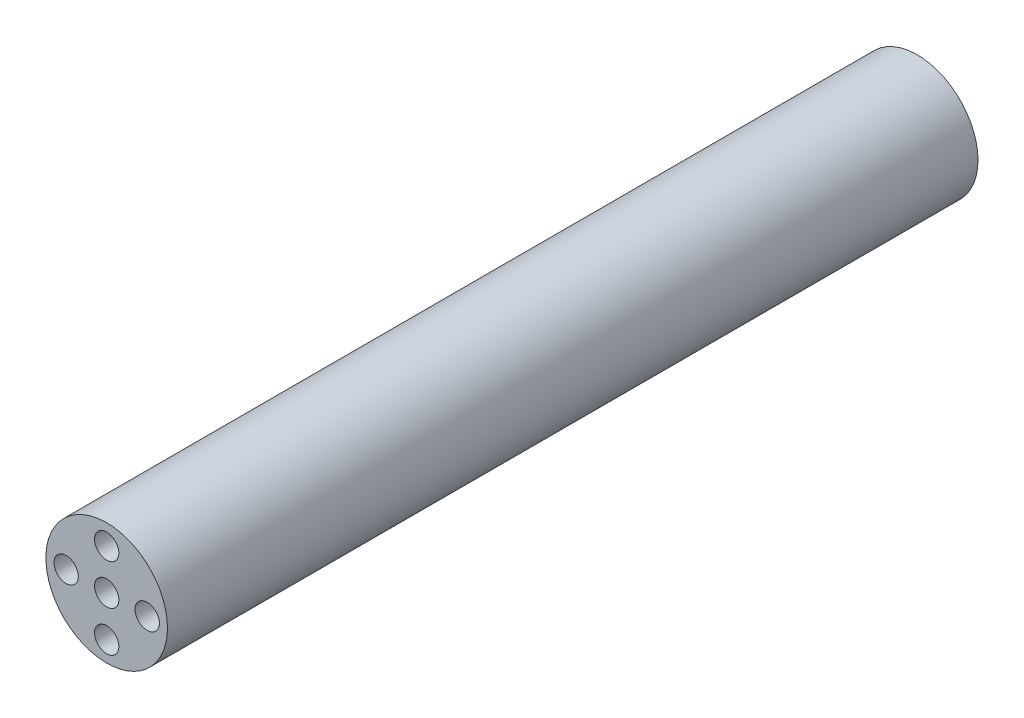
ISO-10303-21;
HEADER;
FILE_DESCRIPTION(('STEP AP214'),'2;1');
FILE_NAME('part.step','',(''),(''),'','','');
FILE_SCHEMA(('AUTOMOTIVE_DESIGN { 1 0 10303 214 1 1 1 1 }'));
ENDSEC;
DATA;
#1=APPLICATION_CONTEXT('core data for automotive mechanical design processes');
#2=APPLICATION_PROTOCOL_DEFINITION('international standard','automotive_design',2000,#1);
#3=PRODUCT_CONTEXT('',#1,'mechanical');
#4=PRODUCT('Part','Part','',(#3));
#5=PRODUCT_RELATED_PRODUCT_CATEGORY('part','',(#4));
#6=PRODUCT_DEFINITION_FORMATION('','',#4);
#7=PRODUCT_DEFINITION_CONTEXT('part definition',#1,'design');
#8=PRODUCT_DEFINITION('design','',#6,#7);
#9=PRODUCT_DEFINITION_SHAPE('','',#8);
#10=(LENGTH_UNIT() NAMED_UNIT(*) SI_UNIT(.MILLI.,.METRE.));
#11=(NAMED_UNIT(*) PLANE_ANGLE_UNIT() SI_UNIT($,.RADIAN.));
#12=(NAMED_UNIT(*) SI_UNIT($,.STERADIAN.) SOLID_ANGLE_UNIT());
#13=UNCERTAINTY_MEASURE_WITH_UNIT(LENGTH_MEASURE(1.E-05),#10,'distance_accuracy_value','');
#14=(GEOMETRIC_REPRESENTATION_CONTEXT(3) GLOBAL_UNCERTAINTY_ASSIGNED_CONTEXT((#13)) GLOBAL_UNIT_ASSIGNED_CONTEXT((#10,
#11,#12)) REPRESENTATION_CONTEXT('',''));
#15=CARTESIAN_POINT('',(0.,0.,0.));
#16=DIRECTION('',(0.,0.,1.));
#17=DIRECTION('',(1.,0.,0.));
#18=AXIS2_PLACEMENT_3D('',#15,#16,#17);
#19=CARTESIAN_POINT('',(0.,0.,100.));
#20=DIRECTION('',(0.,0.,1.));
#21=DIRECTION('',(1.,0.,0.));
#22=AXIS2_PLACEMENT_3D('',#19,#20,#21);
#23=PLANE('',#22);
#24=CARTESIAN_POINT('',(1.40271576953299E-13,-5.,100.));
#25=DIRECTION('',(0.,0.,1.));
#26=DIRECTION('',(1.,0.,0.));
#27=AXIS2_PLACEMENT_3D('',#24,#25,#26);
#28=CIRCLE('',#27,1.50000000000017);
#29=CARTESIAN_POINT('',(1.50000000000031,-5.,100.));
#30=VERTEX_POINT('',#29);
#31=EDGE_CURVE('E72',#30,#30,#28,.T.);
#32=ORIENTED_EDGE('',*,*,#31,.F.);
#33=EDGE_LOOP('',(#32));
#34=FACE_BOUND('',#33,.T.);
#35=CARTESIAN_POINT('',(0.,5.,100.));
#36=DIRECTION('',(0.,0.,1.));
#37=DIRECTION('',(1.,0.,0.));
#38=AXIS2_PLACEMENT_3D('',#35,#36,#37);
#39=CIRCLE('',#38,1.5);
#40=CARTESIAN_POINT('',(1.5,5.,100.));
#41=VERTEX_POINT('',#40);
#42=EDGE_CURVE('E56',#41,#41,#39,.T.);
#43=ORIENTED_EDGE('',*,*,#42,.F.);
#44=EDGE_LOOP('',(#43));
#45=FACE_BOUND('',#44,.T.);
#46=CARTESIAN_POINT('',(0.,0.,100.));
#47=DIRECTION('',(0.,0.,1.));
#48=DIRECTION('',(1.,0.,0.));
#49=AXIS2_PLACEMENT_3D('',#46,#47,#48);
#50=CIRCLE('',#49,7.5);
#51=CARTESIAN_POINT('',(7.5,0.,100.));
#52=VERTEX_POINT('',#51);
#53=EDGE_CURVE('E10',#52,#52,#50,.T.);
#54=ORIENTED_EDGE('',*,*,#53,.T.);
#55=EDGE_LOOP('',(#54));
#56=FACE_BOUND('',#55,.T.);
#57=CARTESIAN_POINT('',(0.,0.,100.));
#58=DIRECTION('',(0.,0.,1.));
#59=DIRECTION('',(1.,0.,0.));
#60=AXIS2_PLACEMENT_3D('',#57,#58,#59);
#61=CIRCLE('',#60,1.5);
#62=CARTESIAN_POINT('',(1.5,0.,100.));
#63=VERTEX_POINT('',#62);
#64=EDGE_CURVE('E50',#63,#63,#61,.T.);
#65=ORIENTED_EDGE('',*,*,#64,.F.);
#66=EDGE_LOOP('',(#65));
#67=FACE_BOUND('',#66,.T.);
#68=CARTESIAN_POINT('',(5.,0.,100.));
#69=DIRECTION('',(0.,0.,1.));
#70=DIRECTION('',(1.,0.,0.));
#71=AXIS2_PLACEMENT_3D('',#68,#69,#70);
#72=CIRCLE('',#71,1.5);
#73=CARTESIAN_POINT('',(6.5,0.,100.));
#74=VERTEX_POINT('',#73);
#75=EDGE_CURVE('E64',#74,#74,#72,.T.);
#76=ORIENTED_EDGE('',*,*,#75,.F.);
#77=EDGE_LOOP('',(#76));
#78=FACE_BOUND('',#77,.T.);
#79=CARTESIAN_POINT('',(-5.,0.,100.));
#80=DIRECTION('',(0.,0.,1.));
#81=DIRECTION('',(1.,0.,0.));
#82=AXIS2_PLACEMENT_3D('',#79,#80,#81);
#83=CIRCLE('',#82,1.5);
#84=CARTESIAN_POINT('',(-3.5,0.,100.));
#85=VERTEX_POINT('',#84);
#86=EDGE_CURVE('E80',#85,#85,#83,.T.);
#87=ORIENTED_EDGE('',*,*,#86,.F.);
#88=EDGE_LOOP('',(#87));
#89=FACE_BOUND('',#88,.T.);
#90=ADVANCED_FACE('F37',(#34,#45,#56,#67,#78,#89),#23,.T.);
#91=CARTESIAN_POINT('',(0.,0.,0.));
#92=DIRECTION('',(0.,0.,1.));
#93=DIRECTION('',(1.,0.,0.));
#94=AXIS2_PLACEMENT_3D('',#91,#92,#93);
#95=PLANE('',#94);
#96=CARTESIAN_POINT('',(0.,0.,0.));
#97=DIRECTION('',(0.,0.,1.));
#98=DIRECTION('',(1.,0.,0.));
#99=AXIS2_PLACEMENT_3D('',#96,#97,#98);
#100=CIRCLE('',#99,7.5);
#101=CARTESIAN_POINT('',(7.5,0.,0.));
#102=VERTEX_POINT('',#101);
#103=EDGE_CURVE('E41',#102,#102,#100,.T.);
#104=ORIENTED_EDGE('',*,*,#103,.F.);
#105=EDGE_LOOP('',(#104));
#106=FACE_BOUND('',#105,.T.);
#107=CARTESIAN_POINT('',(0.,0.,0.));
#108=DIRECTION('',(0.,0.,1.));
#109=DIRECTION('',(1.,0.,0.));
#110=AXIS2_PLACEMENT_3D('',#107,#108,#109);
#111=CIRCLE('',#110,1.5);
#112=CARTESIAN_POINT('',(1.5,0.,0.));
#113=VERTEX_POINT('',#112);
#114=EDGE_CURVE('E52',#113,#113,#111,.T.);
#115=ORIENTED_EDGE('',*,*,#114,.T.);
#116=EDGE_LOOP('',(#115));
#117=FACE_BOUND('',#116,.T.);
#118=CARTESIAN_POINT('',(0.,5.,0.));
#119=DIRECTION('',(0.,0.,1.));
#120=DIRECTION('',(1.,0.,0.));
#121=AXIS2_PLACEMENT_3D('',#118,#119,#120);
#122=CIRCLE('',#121,1.5);
#123=CARTESIAN_POINT('',(1.5,5.,0.));
#124=VERTEX_POINT('',#123);
#125=EDGE_CURVE('E60',#124,#124,#122,.T.);
#126=ORIENTED_EDGE('',*,*,#125,.T.);
#127=EDGE_LOOP('',(#126));
#128=FACE_BOUND('',#127,.T.);
#129=CARTESIAN_POINT('',(5.,0.,0.));
#130=DIRECTION('',(0.,0.,1.));
#131=DIRECTION('',(1.,0.,0.));
#132=AXIS2_PLACEMENT_3D('',#129,#130,#131);
#133=CIRCLE('',#132,1.5);
#134=CARTESIAN_POINT('',(6.5,0.,0.));
#135=VERTEX_POINT('',#134);
#136=EDGE_CURVE('E68',#135,#135,#133,.T.);
#137=ORIENTED_EDGE('',*,*,#136,.T.);
#138=EDGE_LOOP('',(#137));
#139=FACE_BOUND('',#138,.T.);
#140=CARTESIAN_POINT('',(1.40271576953299E-13,-5.,0.));
#141=DIRECTION('',(0.,0.,1.));
#142=DIRECTION('',(1.,0.,0.));
#143=AXIS2_PLACEMENT_3D('',#140,#141,#142);
#144=CIRCLE('',#143,1.50000000000017);
#145=CARTESIAN_POINT('',(1.50000000000031,-5.,0.));
#146=VERTEX_POINT('',#145);
#147=EDGE_CURVE('E76',#146,#146,#144,.T.);
#148=ORIENTED_EDGE('',*,*,#147,.T.);
#149=EDGE_LOOP('',(#148));
#150=FACE_BOUND('',#149,.T.);
#151=CARTESIAN_POINT('',(-5.,0.,0.));
#152=DIRECTION('',(0.,0.,1.));
#153=DIRECTION('',(1.,0.,0.));
#154=AXIS2_PLACEMENT_3D('',#151,#152,#153);
#155=CIRCLE('',#154,1.5);
#156=CARTESIAN_POINT('',(-3.5,0.,0.));
#157=VERTEX_POINT('',#156);
#158=EDGE_CURVE('E84',#157,#157,#155,.T.);
#159=ORIENTED_EDGE('',*,*,#158,.T.);
#160=EDGE_LOOP('',(#159));
#161=FACE_BOUND('',#160,.T.);
#162=ADVANCED_FACE('F96',(#106,#117,#128,#139,#150,#161),#95,.F.);
#163=CARTESIAN_POINT('',(0.,0.,100.));
#164=DIRECTION('',(0.,0.,-1.));
#165=DIRECTION('',(-1.,0.,0.));
#166=AXIS2_PLACEMENT_3D('',#163,#164,#165);
#167=CYLINDRICAL_SURFACE('',#166,7.5);
#168=ORIENTED_EDGE('',*,*,#53,.F.);
#169=EDGE_LOOP('',(#168));
#170=FACE_BOUND('',#169,.T.);
#171=ORIENTED_EDGE('',*,*,#103,.T.);
#172=EDGE_LOOP('',(#171));
#173=FACE_BOUND('',#172,.T.);
#174=ADVANCED_FACE('F39',(#170,#173),#167,.T.);
#175=CARTESIAN_POINT('',(0.,0.,100.));
#176=DIRECTION('',(0.,0.,-1.));
#177=DIRECTION('',(-1.,0.,0.));
#178=AXIS2_PLACEMENT_3D('',#175,#176,#177);
#179=CYLINDRICAL_SURFACE('',#178,1.5);
#180=ORIENTED_EDGE('',*,*,#64,.T.);
#181=EDGE_LOOP('',(#180));
#182=FACE_BOUND('',#181,.T.);
#183=ORIENTED_EDGE('',*,*,#114,.F.);
#184=EDGE_LOOP('',(#183));
#185=FACE_BOUND('',#184,.T.);
#186=ADVANCED_FACE('F106',(#182,#185),#179,.F.);
#187=CARTESIAN_POINT('',(0.,5.,100.));
#188=DIRECTION('',(0.,0.,-1.));
#189=DIRECTION('',(-1.,0.,0.));
#190=AXIS2_PLACEMENT_3D('',#187,#188,#189);
#191=CYLINDRICAL_SURFACE('',#190,1.5);
#192=ORIENTED_EDGE('',*,*,#42,.T.);
#193=EDGE_LOOP('',(#192));
#194=FACE_BOUND('',#193,.T.);
#195=ORIENTED_EDGE('',*,*,#125,.F.);
#196=EDGE_LOOP('',(#195));
#197=FACE_BOUND('',#196,.T.);
#198=ADVANCED_FACE('F109',(#194,#197),#191,.F.);
#199=CARTESIAN_POINT('',(5.,0.,100.));
#200=DIRECTION('',(0.,0.,-1.));
#201=DIRECTION('',(-1.,0.,0.));
#202=AXIS2_PLACEMENT_3D('',#199,#200,#201);
#203=CYLINDRICAL_SURFACE('',#202,1.5);
#204=ORIENTED_EDGE('',*,*,#75,.T.);
#205=EDGE_LOOP('',(#204));
#206=FACE_BOUND('',#205,.T.);
#207=ORIENTED_EDGE('',*,*,#136,.F.);
#208=EDGE_LOOP('',(#207));
#209=FACE_BOUND('',#208,.T.);
#210=ADVANCED_FACE('F113',(#206,#209),#203,.F.);
#211=CARTESIAN_POINT('',(1.40271576953299E-13,-5.,100.));
#212=DIRECTION('',(0.,0.,-1.));
#213=DIRECTION('',(-1.,0.,0.));
#214=AXIS2_PLACEMENT_3D('',#211,#212,#213);
#215=CYLINDRICAL_SURFACE('',#214,1.50000000000017);
#216=ORIENTED_EDGE('',*,*,#31,.T.);
#217=EDGE_LOOP('',(#216));
#218=FACE_BOUND('',#217,.T.);
#219=ORIENTED_EDGE('',*,*,#147,.F.);
#220=EDGE_LOOP('',(#219));
#221=FACE_BOUND('',#220,.T.);
#222=ADVANCED_FACE('F117',(#218,#221),#215,.F.);
#223=CARTESIAN_POINT('',(-5.,0.,100.));
#224=DIRECTION('',(0.,0.,-1.));
#225=DIRECTION('',(-1.,0.,0.));
#226=AXIS2_PLACEMENT_3D('',#223,#224,#225);
#227=CYLINDRICAL_SURFACE('',#226,1.5);
#228=ORIENTED_EDGE('',*,*,#86,.T.);
#229=EDGE_LOOP('',(#228));
#230=FACE_BOUND('',#229,.T.);
#231=ORIENTED_EDGE('',*,*,#158,.F.);
#232=EDGE_LOOP('',(#231));
#233=FACE_BOUND('',#232,.T.);
#234=ADVANCED_FACE('F92',(#230,#233),#227,.F.);
#235=CLOSED_SHELL('',(#90,#162,#174,#186,#198,#210,#222,#234));
#236=MANIFOLD_SOLID_BREP('B2',#235);
#237=ADVANCED_BREP_SHAPE_REPRESENTATION('',(#18,#236),#14);
#238=SHAPE_DEFINITION_REPRESENTATION(#9,#237);
ENDSEC;
END-ISO-10303-21;
